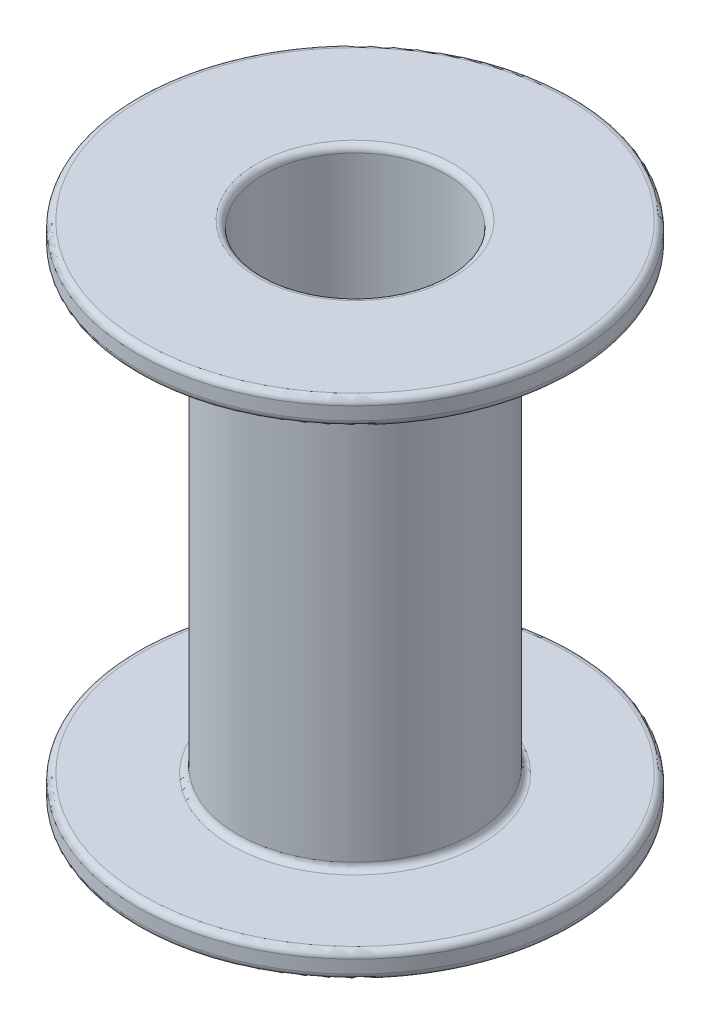
ISO-10303-21;
HEADER;
FILE_DESCRIPTION(('STEP AP214'),'2;1');
FILE_NAME('part.step','',(''),(''),'','','');
FILE_SCHEMA(('AUTOMOTIVE_DESIGN { 1 0 10303 214 1 1 1 1 }'));
ENDSEC;
DATA;
#1=APPLICATION_CONTEXT('core data for automotive mechanical design processes');
#2=APPLICATION_PROTOCOL_DEFINITION('international standard','automotive_design',2000,#1);
#3=PRODUCT_CONTEXT('',#1,'mechanical');
#4=PRODUCT('Part','Part','',(#3));
#5=PRODUCT_RELATED_PRODUCT_CATEGORY('part','',(#4));
#6=PRODUCT_DEFINITION_FORMATION('','',#4);
#7=PRODUCT_DEFINITION_CONTEXT('part definition',#1,'design');
#8=PRODUCT_DEFINITION('design','',#6,#7);
#9=PRODUCT_DEFINITION_SHAPE('','',#8);
#10=(LENGTH_UNIT() NAMED_UNIT(*) SI_UNIT(.MILLI.,.METRE.));
#11=(NAMED_UNIT(*) PLANE_ANGLE_UNIT() SI_UNIT($,.RADIAN.));
#12=(NAMED_UNIT(*) SI_UNIT($,.STERADIAN.) SOLID_ANGLE_UNIT());
#13=UNCERTAINTY_MEASURE_WITH_UNIT(LENGTH_MEASURE(1.E-05),#10,'distance_accuracy_value','');
#14=(GEOMETRIC_REPRESENTATION_CONTEXT(3) GLOBAL_UNCERTAINTY_ASSIGNED_CONTEXT((#13)) GLOBAL_UNIT_ASSIGNED_CONTEXT((#10,
#11,#12)) REPRESENTATION_CONTEXT('',''));
#15=CARTESIAN_POINT('',(0.,0.,0.));
#16=DIRECTION('',(0.,0.,1.));
#17=DIRECTION('',(1.,0.,0.));
#18=AXIS2_PLACEMENT_3D('',#15,#16,#17);
#19=CARTESIAN_POINT('',(0.,39.05,0.));
#20=DIRECTION('',(0.,-1.,0.));
#21=DIRECTION('',(0.,0.,-1.));
#22=AXIS2_PLACEMENT_3D('',#19,#20,#21);
#23=CYLINDRICAL_SURFACE('',#22,16.865);
#24=CARTESIAN_POINT('',(0.,1.5,0.));
#25=DIRECTION('',(0.,1.,0.));
#26=DIRECTION('',(0.,0.,1.));
#27=AXIS2_PLACEMENT_3D('',#24,#25,#26);
#28=CIRCLE('',#27,16.865);
#29=CARTESIAN_POINT('',(0.,1.5,16.865));
#30=VERTEX_POINT('',#29);
#31=EDGE_CURVE('E59',#30,#30,#28,.F.);
#32=ORIENTED_EDGE('',*,*,#31,.T.);
#33=EDGE_LOOP('',(#32));
#34=FACE_BOUND('',#33,.T.);
#35=CARTESIAN_POINT('',(0.,0.5,0.));
#36=DIRECTION('',(0.,1.,0.));
#37=DIRECTION('',(0.,0.,1.));
#38=AXIS2_PLACEMENT_3D('',#35,#36,#37);
#39=CIRCLE('',#38,16.865);
#40=CARTESIAN_POINT('',(0.,0.5,16.865));
#41=VERTEX_POINT('',#40);
#42=EDGE_CURVE('E62',#41,#41,#39,.T.);
#43=ORIENTED_EDGE('',*,*,#42,.T.);
#44=EDGE_LOOP('',(#43));
#45=FACE_BOUND('',#44,.T.);
#46=ADVANCED_FACE('F33',(#34,#45),#23,.T.);
#47=CARTESIAN_POINT('',(0.,37.55,0.));
#48=DIRECTION('',(0.,1.,0.));
#49=DIRECTION('',(0.,0.,1.));
#50=AXIS2_PLACEMENT_3D('',#47,#48,#49);
#51=CIRCLE('',#50,16.865);
#52=CARTESIAN_POINT('',(0.,37.55,16.865));
#53=VERTEX_POINT('',#52);
#54=EDGE_CURVE('E53',#53,#53,#51,.T.);
#55=ORIENTED_EDGE('',*,*,#54,.T.);
#56=EDGE_LOOP('',(#55));
#57=FACE_BOUND('',#56,.T.);
#58=CARTESIAN_POINT('',(0.,38.55,0.));
#59=DIRECTION('',(0.,1.,0.));
#60=DIRECTION('',(0.,0.,1.));
#61=AXIS2_PLACEMENT_3D('',#58,#59,#60);
#62=CIRCLE('',#61,16.865);
#63=CARTESIAN_POINT('',(0.,38.55,16.865));
#64=VERTEX_POINT('',#63);
#65=EDGE_CURVE('E56',#64,#64,#62,.F.);
#66=ORIENTED_EDGE('',*,*,#65,.T.);
#67=EDGE_LOOP('',(#66));
#68=FACE_BOUND('',#67,.T.);
#69=ADVANCED_FACE('F101',(#57,#68),#23,.T.);
#70=CARTESIAN_POINT('',(0.,39.05,0.));
#71=DIRECTION('',(0.,1.,0.));
#72=DIRECTION('',(0.,0.,1.));
#73=AXIS2_PLACEMENT_3D('',#70,#71,#72);
#74=PLANE('',#73);
#75=CARTESIAN_POINT('',(0.,39.05,0.));
#76=DIRECTION('',(0.,1.,0.));
#77=DIRECTION('',(0.,0.,1.));
#78=AXIS2_PLACEMENT_3D('',#75,#76,#77);
#79=CIRCLE('',#78,7.6);
#80=CARTESIAN_POINT('',(0.,39.05,7.6));
#81=VERTEX_POINT('',#80);
#82=EDGE_CURVE('E71',#81,#81,#79,.F.);
#83=ORIENTED_EDGE('',*,*,#82,.T.);
#84=EDGE_LOOP('',(#83));
#85=FACE_BOUND('',#84,.T.);
#86=CARTESIAN_POINT('',(0.,39.05,0.));
#87=DIRECTION('',(0.,1.,0.));
#88=DIRECTION('',(0.,0.,1.));
#89=AXIS2_PLACEMENT_3D('',#86,#87,#88);
#90=CIRCLE('',#89,16.365);
#91=CARTESIAN_POINT('',(0.,39.05,16.365));
#92=VERTEX_POINT('',#91);
#93=EDGE_CURVE('E74',#92,#92,#90,.T.);
#94=ORIENTED_EDGE('',*,*,#93,.T.);
#95=EDGE_LOOP('',(#94));
#96=FACE_BOUND('',#95,.T.);
#97=ADVANCED_FACE('F107',(#85,#96),#74,.T.);
#98=CARTESIAN_POINT('',(0.,0.,0.));
#99=DIRECTION('',(0.,1.,0.));
#100=DIRECTION('',(0.,0.,1.));
#101=AXIS2_PLACEMENT_3D('',#98,#99,#100);
#102=PLANE('',#101);
#103=CARTESIAN_POINT('',(0.,0.,0.));
#104=DIRECTION('',(0.,1.,0.));
#105=DIRECTION('',(0.,0.,1.));
#106=AXIS2_PLACEMENT_3D('',#103,#104,#105);
#107=CIRCLE('',#106,7.6);
#108=CARTESIAN_POINT('',(0.,0.,7.6));
#109=VERTEX_POINT('',#108);
#110=EDGE_CURVE('E83',#109,#109,#107,.T.);
#111=ORIENTED_EDGE('',*,*,#110,.T.);
#112=EDGE_LOOP('',(#111));
#113=FACE_BOUND('',#112,.T.);
#114=CARTESIAN_POINT('',(0.,0.,0.));
#115=DIRECTION('',(0.,1.,0.));
#116=DIRECTION('',(0.,0.,1.));
#117=AXIS2_PLACEMENT_3D('',#114,#115,#116);
#118=CIRCLE('',#117,16.365);
#119=CARTESIAN_POINT('',(0.,0.,16.365));
#120=VERTEX_POINT('',#119);
#121=EDGE_CURVE('E86',#120,#120,#118,.F.);
#122=ORIENTED_EDGE('',*,*,#121,.T.);
#123=EDGE_LOOP('',(#122));
#124=FACE_BOUND('',#123,.T.);
#125=ADVANCED_FACE('F90',(#113,#124),#102,.F.);
#126=CARTESIAN_POINT('',(0.,0.,0.));
#127=DIRECTION('',(0.,1.,0.));
#128=DIRECTION('',(0.,0.,1.));
#129=AXIS2_PLACEMENT_3D('',#126,#127,#128);
#130=CYLINDRICAL_SURFACE('',#129,7.1);
#131=CARTESIAN_POINT('',(0.,0.5,0.));
#132=DIRECTION('',(0.,1.,0.));
#133=DIRECTION('',(0.,0.,1.));
#134=AXIS2_PLACEMENT_3D('',#131,#132,#133);
#135=CIRCLE('',#134,7.1);
#136=CARTESIAN_POINT('',(0.,0.5,7.1));
#137=VERTEX_POINT('',#136);
#138=EDGE_CURVE('E77',#137,#137,#135,.F.);
#139=ORIENTED_EDGE('',*,*,#138,.T.);
#140=EDGE_LOOP('',(#139));
#141=FACE_BOUND('',#140,.T.);
#142=CARTESIAN_POINT('',(0.,38.55,0.));
#143=DIRECTION('',(0.,1.,0.));
#144=DIRECTION('',(0.,0.,1.));
#145=AXIS2_PLACEMENT_3D('',#142,#143,#144);
#146=CIRCLE('',#145,7.1);
#147=CARTESIAN_POINT('',(0.,38.55,7.1));
#148=VERTEX_POINT('',#147);
#149=EDGE_CURVE('E80',#148,#148,#146,.T.);
#150=ORIENTED_EDGE('',*,*,#149,.T.);
#151=EDGE_LOOP('',(#150));
#152=FACE_BOUND('',#151,.T.);
#153=ADVANCED_FACE('F143',(#141,#152),#130,.F.);
#154=CARTESIAN_POINT('',(0.,37.05,0.));
#155=DIRECTION('',(0.,1.,0.));
#156=DIRECTION('',(0.,0.,1.));
#157=AXIS2_PLACEMENT_3D('',#154,#155,#156);
#158=PLANE('',#157);
#159=CARTESIAN_POINT('',(0.,37.05,0.));
#160=DIRECTION('',(0.,1.,0.));
#161=DIRECTION('',(0.,0.,1.));
#162=AXIS2_PLACEMENT_3D('',#159,#160,#161);
#163=CIRCLE('',#162,16.365);
#164=CARTESIAN_POINT('',(0.,37.05,16.365));
#165=VERTEX_POINT('',#164);
#166=EDGE_CURVE('E44',#165,#165,#163,.F.);
#167=ORIENTED_EDGE('',*,*,#166,.T.);
#168=EDGE_LOOP('',(#167));
#169=FACE_BOUND('',#168,.T.);
#170=CARTESIAN_POINT('',(0.,37.05,0.));
#171=DIRECTION('',(0.,1.,0.));
#172=DIRECTION('',(0.,0.,1.));
#173=AXIS2_PLACEMENT_3D('',#170,#171,#172);
#174=CIRCLE('',#173,9.6);
#175=CARTESIAN_POINT('',(0.,37.05,9.6));
#176=VERTEX_POINT('',#175);
#177=EDGE_CURVE('E48',#176,#176,#174,.T.);
#178=ORIENTED_EDGE('',*,*,#177,.T.);
#179=EDGE_LOOP('',(#178));
#180=FACE_BOUND('',#179,.T.);
#181=ADVANCED_FACE('F140',(#169,#180),#158,.F.);
#182=CARTESIAN_POINT('',(0.,2.,0.));
#183=DIRECTION('',(0.,1.,0.));
#184=DIRECTION('',(0.,0.,1.));
#185=AXIS2_PLACEMENT_3D('',#182,#183,#184);
#186=PLANE('',#185);
#187=CARTESIAN_POINT('',(0.,2.,0.));
#188=DIRECTION('',(0.,1.,0.));
#189=DIRECTION('',(0.,0.,1.));
#190=AXIS2_PLACEMENT_3D('',#187,#188,#189);
#191=CIRCLE('',#190,16.365);
#192=CARTESIAN_POINT('',(0.,2.,16.365));
#193=VERTEX_POINT('',#192);
#194=EDGE_CURVE('E65',#193,#193,#191,.T.);
#195=ORIENTED_EDGE('',*,*,#194,.T.);
#196=EDGE_LOOP('',(#195));
#197=FACE_BOUND('',#196,.T.);
#198=CARTESIAN_POINT('',(0.,2.,0.));
#199=DIRECTION('',(0.,1.,0.));
#200=DIRECTION('',(0.,0.,1.));
#201=AXIS2_PLACEMENT_3D('',#198,#199,#200);
#202=CIRCLE('',#201,9.6);
#203=CARTESIAN_POINT('',(0.,2.,9.6));
#204=VERTEX_POINT('',#203);
#205=EDGE_CURVE('E68',#204,#204,#202,.F.);
#206=ORIENTED_EDGE('',*,*,#205,.T.);
#207=EDGE_LOOP('',(#206));
#208=FACE_BOUND('',#207,.T.);
#209=ADVANCED_FACE('F142',(#197,#208),#186,.T.);
#210=CARTESIAN_POINT('',(0.,0.,0.));
#211=DIRECTION('',(0.,1.,0.));
#212=DIRECTION('',(0.,0.,1.));
#213=AXIS2_PLACEMENT_3D('',#210,#211,#212);
#214=CYLINDRICAL_SURFACE('',#213,9.1);
#215=CARTESIAN_POINT('',(0.,36.55,0.));
#216=DIRECTION('',(0.,1.,0.));
#217=DIRECTION('',(0.,0.,1.));
#218=AXIS2_PLACEMENT_3D('',#215,#216,#217);
#219=CIRCLE('',#218,9.1);
#220=CARTESIAN_POINT('',(0.,36.55,9.1));
#221=VERTEX_POINT('',#220);
#222=EDGE_CURVE('E10',#221,#221,#219,.F.);
#223=ORIENTED_EDGE('',*,*,#222,.T.);
#224=EDGE_LOOP('',(#223));
#225=FACE_BOUND('',#224,.T.);
#226=CARTESIAN_POINT('',(0.,2.5,0.));
#227=DIRECTION('',(0.,1.,0.));
#228=DIRECTION('',(0.,0.,1.));
#229=AXIS2_PLACEMENT_3D('',#226,#227,#228);
#230=CIRCLE('',#229,9.1);
#231=CARTESIAN_POINT('',(0.,2.5,9.1));
#232=VERTEX_POINT('',#231);
#233=EDGE_CURVE('E40',#232,#232,#230,.T.);
#234=ORIENTED_EDGE('',*,*,#233,.T.);
#235=EDGE_LOOP('',(#234));
#236=FACE_BOUND('',#235,.T.);
#237=ADVANCED_FACE('F116',(#225,#236),#214,.T.);
#238=CARTESIAN_POINT('',(0.,0.5,0.));
#239=DIRECTION('',(0.,1.,0.));
#240=DIRECTION('',(0.,0.,1.));
#241=AXIS2_PLACEMENT_3D('',#238,#239,#240);
#242=TOROIDAL_SURFACE('',#241,7.6,0.5);
#243=ORIENTED_EDGE('',*,*,#138,.F.);
#244=EDGE_LOOP('',(#243));
#245=FACE_BOUND('',#244,.T.);
#246=ORIENTED_EDGE('',*,*,#110,.F.);
#247=EDGE_LOOP('',(#246));
#248=FACE_BOUND('',#247,.T.);
#249=ADVANCED_FACE('F112',(#245,#248),#242,.T.);
#250=CARTESIAN_POINT('',(0.,38.55,0.));
#251=DIRECTION('',(0.,1.,0.));
#252=DIRECTION('',(0.,0.,1.));
#253=AXIS2_PLACEMENT_3D('',#250,#251,#252);
#254=TOROIDAL_SURFACE('',#253,7.6,0.5);
#255=ORIENTED_EDGE('',*,*,#82,.F.);
#256=EDGE_LOOP('',(#255));
#257=FACE_BOUND('',#256,.T.);
#258=ORIENTED_EDGE('',*,*,#149,.F.);
#259=EDGE_LOOP('',(#258));
#260=FACE_BOUND('',#259,.T.);
#261=ADVANCED_FACE('F115',(#257,#260),#254,.T.);
#262=CARTESIAN_POINT('',(0.,1.5,0.));
#263=DIRECTION('',(0.,1.,0.));
#264=DIRECTION('',(0.,0.,1.));
#265=AXIS2_PLACEMENT_3D('',#262,#263,#264);
#266=TOROIDAL_SURFACE('',#265,16.365,0.5);
#267=ORIENTED_EDGE('',*,*,#31,.F.);
#268=EDGE_LOOP('',(#267));
#269=FACE_BOUND('',#268,.T.);
#270=ORIENTED_EDGE('',*,*,#194,.F.);
#271=EDGE_LOOP('',(#270));
#272=FACE_BOUND('',#271,.T.);
#273=ADVANCED_FACE('F96',(#269,#272),#266,.T.);
#274=CARTESIAN_POINT('',(0.,0.5,0.));
#275=DIRECTION('',(0.,1.,0.));
#276=DIRECTION('',(0.,0.,1.));
#277=AXIS2_PLACEMENT_3D('',#274,#275,#276);
#278=TOROIDAL_SURFACE('',#277,16.365,0.5);
#279=ORIENTED_EDGE('',*,*,#121,.F.);
#280=EDGE_LOOP('',(#279));
#281=FACE_BOUND('',#280,.T.);
#282=ORIENTED_EDGE('',*,*,#42,.F.);
#283=EDGE_LOOP('',(#282));
#284=FACE_BOUND('',#283,.T.);
#285=ADVANCED_FACE('F92',(#281,#284),#278,.T.);
#286=CARTESIAN_POINT('',(0.,37.55,0.));
#287=DIRECTION('',(0.,1.,0.));
#288=DIRECTION('',(0.,0.,1.));
#289=AXIS2_PLACEMENT_3D('',#286,#287,#288);
#290=TOROIDAL_SURFACE('',#289,16.365,0.5);
#291=ORIENTED_EDGE('',*,*,#166,.F.);
#292=EDGE_LOOP('',(#291));
#293=FACE_BOUND('',#292,.T.);
#294=ORIENTED_EDGE('',*,*,#54,.F.);
#295=EDGE_LOOP('',(#294));
#296=FACE_BOUND('',#295,.T.);
#297=ADVANCED_FACE('F95',(#293,#296),#290,.T.);
#298=CARTESIAN_POINT('',(0.,38.55,0.));
#299=DIRECTION('',(0.,1.,0.));
#300=DIRECTION('',(0.,0.,1.));
#301=AXIS2_PLACEMENT_3D('',#298,#299,#300);
#302=TOROIDAL_SURFACE('',#301,16.365,0.5);
#303=ORIENTED_EDGE('',*,*,#65,.F.);
#304=EDGE_LOOP('',(#303));
#305=FACE_BOUND('',#304,.T.);
#306=ORIENTED_EDGE('',*,*,#93,.F.);
#307=EDGE_LOOP('',(#306));
#308=FACE_BOUND('',#307,.T.);
#309=ADVANCED_FACE('F126',(#305,#308),#302,.T.);
#310=CARTESIAN_POINT('',(0.,36.55,0.));
#311=DIRECTION('',(0.,1.,0.));
#312=DIRECTION('',(0.,0.,1.));
#313=AXIS2_PLACEMENT_3D('',#310,#311,#312);
#314=TOROIDAL_SURFACE('',#313,9.6,0.5);
#315=ORIENTED_EDGE('',*,*,#222,.F.);
#316=EDGE_LOOP('',(#315));
#317=FACE_BOUND('',#316,.T.);
#318=ORIENTED_EDGE('',*,*,#177,.F.);
#319=EDGE_LOOP('',(#318));
#320=FACE_BOUND('',#319,.T.);
#321=ADVANCED_FACE('F129',(#317,#320),#314,.F.);
#322=CARTESIAN_POINT('',(0.,2.5,0.));
#323=DIRECTION('',(0.,1.,0.));
#324=DIRECTION('',(0.,0.,1.));
#325=AXIS2_PLACEMENT_3D('',#322,#323,#324);
#326=TOROIDAL_SURFACE('',#325,9.6,0.5);
#327=ORIENTED_EDGE('',*,*,#205,.F.);
#328=EDGE_LOOP('',(#327));
#329=FACE_BOUND('',#328,.T.);
#330=ORIENTED_EDGE('',*,*,#233,.F.);
#331=EDGE_LOOP('',(#330));
#332=FACE_BOUND('',#331,.T.);
#333=ADVANCED_FACE('F35',(#329,#332),#326,.F.);
#334=CLOSED_SHELL('',(#46,#69,#97,#125,#153,#181,#209,#237,#249,#261,#273,#285,#297,#309,#321,#333));
#335=MANIFOLD_SOLID_BREP('B2',#334);
#336=ADVANCED_BREP_SHAPE_REPRESENTATION('',(#18,#335),#14);
#337=SHAPE_DEFINITION_REPRESENTATION(#9,#336);
ENDSEC;
END-ISO-10303-21;
